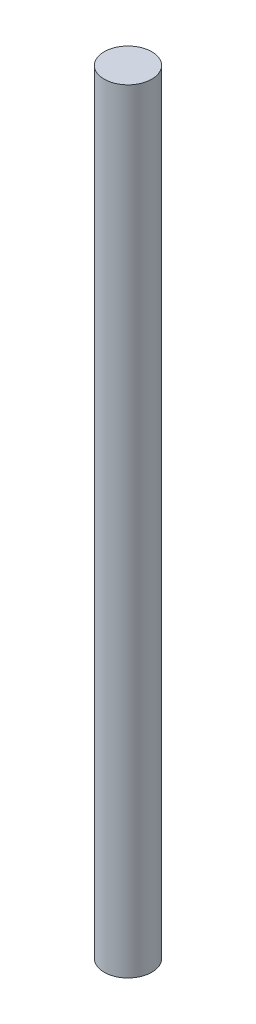
ISO-10303-21;
HEADER;
FILE_DESCRIPTION(('STEP AP214'),'2;1');
FILE_NAME('part.step','',(''),(''),'','','');
FILE_SCHEMA(('AUTOMOTIVE_DESIGN { 1 0 10303 214 1 1 1 1 }'));
ENDSEC;
DATA;
#1=APPLICATION_CONTEXT('core data for automotive mechanical design processes');
#2=APPLICATION_PROTOCOL_DEFINITION('international standard','automotive_design',2000,#1);
#3=PRODUCT_CONTEXT('',#1,'mechanical');
#4=PRODUCT('Part','Part','',(#3));
#5=PRODUCT_RELATED_PRODUCT_CATEGORY('part','',(#4));
#6=PRODUCT_DEFINITION_FORMATION('','',#4);
#7=PRODUCT_DEFINITION_CONTEXT('part definition',#1,'design');
#8=PRODUCT_DEFINITION('design','',#6,#7);
#9=PRODUCT_DEFINITION_SHAPE('','',#8);
#10=(LENGTH_UNIT() NAMED_UNIT(*) SI_UNIT(.MILLI.,.METRE.));
#11=(NAMED_UNIT(*) PLANE_ANGLE_UNIT() SI_UNIT($,.RADIAN.));
#12=(NAMED_UNIT(*) SI_UNIT($,.STERADIAN.) SOLID_ANGLE_UNIT());
#13=UNCERTAINTY_MEASURE_WITH_UNIT(LENGTH_MEASURE(1.E-05),#10,'distance_accuracy_value','');
#14=(GEOMETRIC_REPRESENTATION_CONTEXT(3) GLOBAL_UNCERTAINTY_ASSIGNED_CONTEXT((#13)) GLOBAL_UNIT_ASSIGNED_CONTEXT((#10,
#11,#12)) REPRESENTATION_CONTEXT('',''));
#15=CARTESIAN_POINT('',(0.,0.,0.));
#16=DIRECTION('',(0.,0.,1.));
#17=DIRECTION('',(1.,0.,0.));
#18=AXIS2_PLACEMENT_3D('',#15,#16,#17);
#19=CARTESIAN_POINT('',(0.,-130.,0.));
#20=DIRECTION('',(0.,1.,0.));
#21=DIRECTION('',(0.,0.,1.));
#22=AXIS2_PLACEMENT_3D('',#19,#20,#21);
#23=CYLINDRICAL_SURFACE('',#22,4.);
#24=CARTESIAN_POINT('',(0.,-130.,0.));
#25=DIRECTION('',(0.,1.,0.));
#26=DIRECTION('',(0.,0.,1.));
#27=AXIS2_PLACEMENT_3D('',#24,#25,#26);
#28=CIRCLE('',#27,4.);
#29=CARTESIAN_POINT('',(0.,-130.,4.));
#30=VERTEX_POINT('',#29);
#31=EDGE_CURVE('E10',#30,#30,#28,.T.);
#32=ORIENTED_EDGE('',*,*,#31,.T.);
#33=EDGE_LOOP('',(#32));
#34=FACE_BOUND('',#33,.T.);
#35=CARTESIAN_POINT('',(0.,0.,0.));
#36=DIRECTION('',(0.,1.,0.));
#37=DIRECTION('',(0.,0.,1.));
#38=AXIS2_PLACEMENT_3D('',#35,#36,#37);
#39=CIRCLE('',#38,4.);
#40=CARTESIAN_POINT('',(0.,0.,4.));
#41=VERTEX_POINT('',#40);
#42=EDGE_CURVE('E33',#41,#41,#39,.T.);
#43=ORIENTED_EDGE('',*,*,#42,.F.);
#44=EDGE_LOOP('',(#43));
#45=FACE_BOUND('',#44,.T.);
#46=ADVANCED_FACE('F30',(#34,#45),#23,.T.);
#47=CARTESIAN_POINT('',(0.,-130.,0.));
#48=DIRECTION('',(0.,1.,0.));
#49=DIRECTION('',(0.,0.,1.));
#50=AXIS2_PLACEMENT_3D('',#47,#48,#49);
#51=PLANE('',#50);
#52=ORIENTED_EDGE('',*,*,#31,.F.);
#53=EDGE_LOOP('',(#52));
#54=FACE_BOUND('',#53,.T.);
#55=ADVANCED_FACE('F45',(#54),#51,.F.);
#56=CARTESIAN_POINT('',(0.,0.,0.));
#57=DIRECTION('',(0.,1.,0.));
#58=DIRECTION('',(0.,0.,1.));
#59=AXIS2_PLACEMENT_3D('',#56,#57,#58);
#60=PLANE('',#59);
#61=ORIENTED_EDGE('',*,*,#42,.T.);
#62=EDGE_LOOP('',(#61));
#63=FACE_BOUND('',#62,.T.);
#64=ADVANCED_FACE('F42',(#63),#60,.T.);
#65=CLOSED_SHELL('',(#46,#55,#64));
#66=MANIFOLD_SOLID_BREP('B2',#65);
#67=ADVANCED_BREP_SHAPE_REPRESENTATION('',(#18,#66),#14);
#68=SHAPE_DEFINITION_REPRESENTATION(#9,#67);
ENDSEC;
END-ISO-10303-21;
